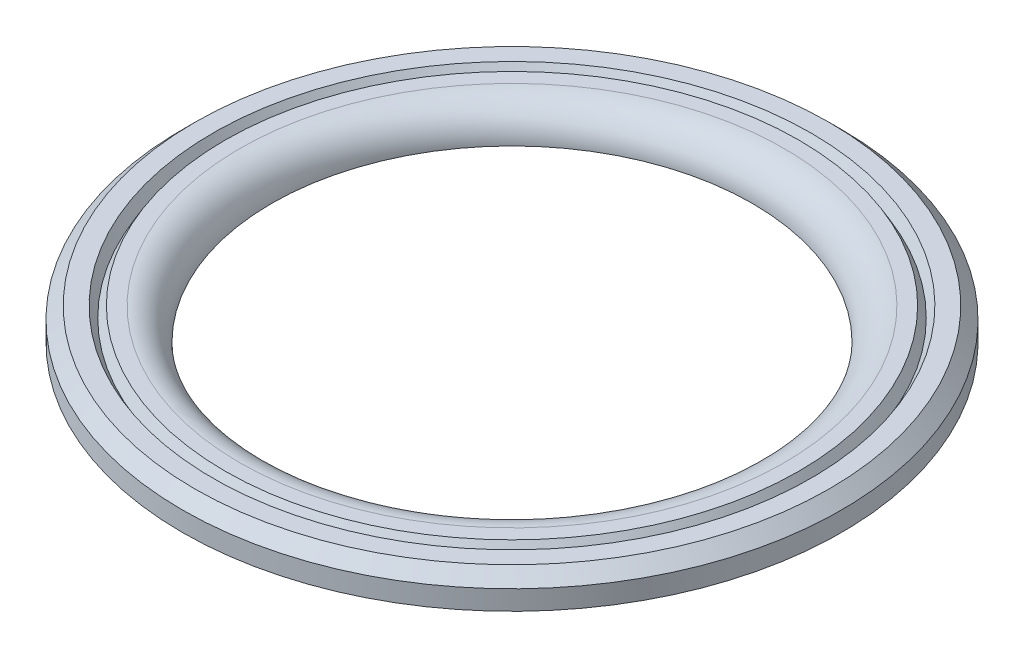
ISO-10303-21;
HEADER;
FILE_DESCRIPTION(('STEP AP214'),'2;1');
FILE_NAME('part.step','',(''),(''),'','','');
FILE_SCHEMA(('AUTOMOTIVE_DESIGN { 1 0 10303 214 1 1 1 1 }'));
ENDSEC;
DATA;
#1=APPLICATION_CONTEXT('core data for automotive mechanical design processes');
#2=APPLICATION_PROTOCOL_DEFINITION('international standard','automotive_design',2000,#1);
#3=PRODUCT_CONTEXT('',#1,'mechanical');
#4=PRODUCT('Part','Part','',(#3));
#5=PRODUCT_RELATED_PRODUCT_CATEGORY('part','',(#4));
#6=PRODUCT_DEFINITION_FORMATION('','',#4);
#7=PRODUCT_DEFINITION_CONTEXT('part definition',#1,'design');
#8=PRODUCT_DEFINITION('design','',#6,#7);
#9=PRODUCT_DEFINITION_SHAPE('','',#8);
#10=(LENGTH_UNIT() NAMED_UNIT(*) SI_UNIT(.MILLI.,.METRE.));
#11=(NAMED_UNIT(*) PLANE_ANGLE_UNIT() SI_UNIT($,.RADIAN.));
#12=(NAMED_UNIT(*) SI_UNIT($,.STERADIAN.) SOLID_ANGLE_UNIT());
#13=UNCERTAINTY_MEASURE_WITH_UNIT(LENGTH_MEASURE(1.E-05),#10,'distance_accuracy_value','');
#14=(GEOMETRIC_REPRESENTATION_CONTEXT(3) GLOBAL_UNCERTAINTY_ASSIGNED_CONTEXT((#13)) GLOBAL_UNIT_ASSIGNED_CONTEXT((#10,
#11,#12)) REPRESENTATION_CONTEXT('',''));
#15=CARTESIAN_POINT('',(0.,0.,0.));
#16=DIRECTION('',(0.,0.,1.));
#17=DIRECTION('',(1.,0.,0.));
#18=AXIS2_PLACEMENT_3D('',#15,#16,#17);
#19=CARTESIAN_POINT('',(0.,2.6,0.));
#20=DIRECTION('',(0.,1.,0.));
#21=DIRECTION('',(0.,0.,1.));
#22=AXIS2_PLACEMENT_3D('',#19,#20,#21);
#23=PLANE('',#22);
#24=CARTESIAN_POINT('',(0.,2.6,0.));
#25=DIRECTION('',(0.,-1.,0.));
#26=DIRECTION('',(0.,0.,-1.));
#27=AXIS2_PLACEMENT_3D('',#24,#25,#26);
#28=CIRCLE('',#27,24.5);
#29=CARTESIAN_POINT('',(0.,2.6,-24.5));
#30=VERTEX_POINT('',#29);
#31=EDGE_CURVE('E56',#30,#30,#28,.T.);
#32=ORIENTED_EDGE('',*,*,#31,.T.);
#33=EDGE_LOOP('',(#32));
#34=FACE_BOUND('',#33,.T.);
#35=CARTESIAN_POINT('',(0.,2.6,0.));
#36=DIRECTION('',(0.,1.,0.));
#37=DIRECTION('',(0.,0.,1.));
#38=AXIS2_PLACEMENT_3D('',#35,#36,#37);
#39=CIRCLE('',#38,26.);
#40=CARTESIAN_POINT('',(0.,2.6,26.));
#41=VERTEX_POINT('',#40);
#42=EDGE_CURVE('E40',#41,#41,#39,.T.);
#43=ORIENTED_EDGE('',*,*,#42,.T.);
#44=EDGE_LOOP('',(#43));
#45=FACE_BOUND('',#44,.T.);
#46=ADVANCED_FACE('F33',(#34,#45),#23,.T.);
#47=CARTESIAN_POINT('',(0.,2.6,0.));
#48=DIRECTION('',(0.,-1.,0.));
#49=DIRECTION('',(0.,0.,-1.));
#50=AXIS2_PLACEMENT_3D('',#47,#48,#49);
#51=CIRCLE('',#50,23.5);
#52=CARTESIAN_POINT('',(0.,2.6,-23.5));
#53=VERTEX_POINT('',#52);
#54=EDGE_CURVE('E62',#53,#53,#51,.T.);
#55=ORIENTED_EDGE('',*,*,#54,.F.);
#56=EDGE_LOOP('',(#55));
#57=FACE_BOUND('',#56,.T.);
#58=CARTESIAN_POINT('',(0.,2.6,0.));
#59=DIRECTION('',(0.,1.,0.));
#60=DIRECTION('',(0.,0.,1.));
#61=AXIS2_PLACEMENT_3D('',#58,#59,#60);
#62=CIRCLE('',#61,22.3);
#63=CARTESIAN_POINT('',(0.,2.6,22.3));
#64=VERTEX_POINT('',#63);
#65=EDGE_CURVE('E44',#64,#64,#62,.F.);
#66=ORIENTED_EDGE('',*,*,#65,.T.);
#67=EDGE_LOOP('',(#66));
#68=FACE_BOUND('',#67,.T.);
#69=ADVANCED_FACE('F68',(#57,#68),#23,.T.);
#70=CARTESIAN_POINT('',(0.,0.,0.));
#71=DIRECTION('',(0.,1.,0.));
#72=DIRECTION('',(0.,0.,1.));
#73=AXIS2_PLACEMENT_3D('',#70,#71,#72);
#74=PLANE('',#73);
#75=CARTESIAN_POINT('',(0.,0.,0.));
#76=DIRECTION('',(0.,1.,0.));
#77=DIRECTION('',(0.,0.,1.));
#78=AXIS2_PLACEMENT_3D('',#75,#76,#77);
#79=CIRCLE('',#78,27.);
#80=CARTESIAN_POINT('',(0.,0.,27.));
#81=VERTEX_POINT('',#80);
#82=EDGE_CURVE('E48',#81,#81,#79,.T.);
#83=ORIENTED_EDGE('',*,*,#82,.F.);
#84=EDGE_LOOP('',(#83));
#85=FACE_BOUND('',#84,.T.);
#86=CARTESIAN_POINT('',(0.,0.,0.));
#87=DIRECTION('',(0.,1.,0.));
#88=DIRECTION('',(0.,0.,1.));
#89=AXIS2_PLACEMENT_3D('',#86,#87,#88);
#90=CIRCLE('',#89,19.7);
#91=CARTESIAN_POINT('',(0.,0.,19.7));
#92=VERTEX_POINT('',#91);
#93=EDGE_CURVE('E53',#92,#92,#90,.T.);
#94=ORIENTED_EDGE('',*,*,#93,.T.);
#95=EDGE_LOOP('',(#94));
#96=FACE_BOUND('',#95,.T.);
#97=ADVANCED_FACE('F71',(#85,#96),#74,.F.);
#98=CARTESIAN_POINT('',(0.,2.6,0.));
#99=DIRECTION('',(0.,-1.,0.));
#100=DIRECTION('',(0.,0.,-1.));
#101=AXIS2_PLACEMENT_3D('',#98,#99,#100);
#102=CYLINDRICAL_SURFACE('',#101,27.);
#103=CARTESIAN_POINT('',(0.,1.60000000000001,0.));
#104=DIRECTION('',(0.,1.,0.));
#105=DIRECTION('',(0.,0.,1.));
#106=AXIS2_PLACEMENT_3D('',#103,#104,#105);
#107=CIRCLE('',#106,27.);
#108=CARTESIAN_POINT('',(0.,1.60000000000001,27.));
#109=VERTEX_POINT('',#108);
#110=EDGE_CURVE('E10',#109,#109,#107,.F.);
#111=ORIENTED_EDGE('',*,*,#110,.T.);
#112=EDGE_LOOP('',(#111));
#113=FACE_BOUND('',#112,.T.);
#114=ORIENTED_EDGE('',*,*,#82,.T.);
#115=EDGE_LOOP('',(#114));
#116=FACE_BOUND('',#115,.T.);
#117=ADVANCED_FACE('F78',(#113,#116),#102,.T.);
#118=CARTESIAN_POINT('',(0.,0.,0.));
#119=DIRECTION('',(0.,1.,0.));
#120=DIRECTION('',(0.,0.,1.));
#121=AXIS2_PLACEMENT_3D('',#118,#119,#120);
#122=TOROIDAL_SURFACE('',#121,22.3,2.6);
#123=ORIENTED_EDGE('',*,*,#65,.F.);
#124=EDGE_LOOP('',(#123));
#125=FACE_BOUND('',#124,.T.);
#126=ORIENTED_EDGE('',*,*,#93,.F.);
#127=EDGE_LOOP('',(#126));
#128=FACE_BOUND('',#127,.T.);
#129=ADVANCED_FACE('F75',(#125,#128),#122,.T.);
#130=CARTESIAN_POINT('',(0.,2.6,0.));
#131=DIRECTION('',(0.,-1.,0.));
#132=DIRECTION('',(0.,0.,-1.));
#133=AXIS2_PLACEMENT_3D('',#130,#131,#132);
#134=CONICAL_SURFACE('',#133,26.,0.785398163397447);
#135=ORIENTED_EDGE('',*,*,#110,.F.);
#136=EDGE_LOOP('',(#135));
#137=FACE_BOUND('',#136,.T.);
#138=ORIENTED_EDGE('',*,*,#42,.F.);
#139=EDGE_LOOP('',(#138));
#140=FACE_BOUND('',#139,.T.);
#141=ADVANCED_FACE('F35',(#137,#140),#134,.T.);
#142=CARTESIAN_POINT('',(0.,1.73397459621556,0.));
#143=DIRECTION('',(0.,1.,0.));
#144=DIRECTION('',(0.,0.,1.));
#145=AXIS2_PLACEMENT_3D('',#142,#143,#144);
#146=CONICAL_SURFACE('',#145,24.,0.523598775598293);
#147=ORIENTED_EDGE('',*,*,#31,.F.);
#148=EDGE_LOOP('',(#147));
#149=FACE_BOUND('',#148,.T.);
#150=CARTESIAN_POINT('',(0.,1.73397459621556,0.));
#151=DIRECTION('',(0.,-1.,0.));
#152=DIRECTION('',(0.,0.,-1.));
#153=AXIS2_PLACEMENT_3D('',#150,#151,#152);
#154=CIRCLE('',#153,24.);
#155=CARTESIAN_POINT('',(0.,1.73397459621556,-24.));
#156=VERTEX_POINT('',#155);
#157=EDGE_CURVE('E59',#156,#156,#154,.T.);
#158=ORIENTED_EDGE('',*,*,#157,.T.);
#159=EDGE_LOOP('',(#158));
#160=FACE_BOUND('',#159,.T.);
#161=ADVANCED_FACE('F94',(#149,#160),#146,.F.);
#162=CARTESIAN_POINT('',(0.,2.6,0.));
#163=DIRECTION('',(0.,-1.,0.));
#164=DIRECTION('',(0.,0.,-1.));
#165=AXIS2_PLACEMENT_3D('',#162,#163,#164);
#166=CONICAL_SURFACE('',#165,23.5,0.523598775598299);
#167=ORIENTED_EDGE('',*,*,#157,.F.);
#168=EDGE_LOOP('',(#167));
#169=FACE_BOUND('',#168,.T.);
#170=ORIENTED_EDGE('',*,*,#54,.T.);
#171=EDGE_LOOP('',(#170));
#172=FACE_BOUND('',#171,.T.);
#173=ADVANCED_FACE('F66',(#169,#172),#166,.T.);
#174=CLOSED_SHELL('',(#46,#69,#97,#117,#129,#141,#161,#173));
#175=MANIFOLD_SOLID_BREP('B2',#174);
#176=ADVANCED_BREP_SHAPE_REPRESENTATION('',(#18,#175),#14);
#177=SHAPE_DEFINITION_REPRESENTATION(#9,#176);
ENDSEC;
END-ISO-10303-21;
